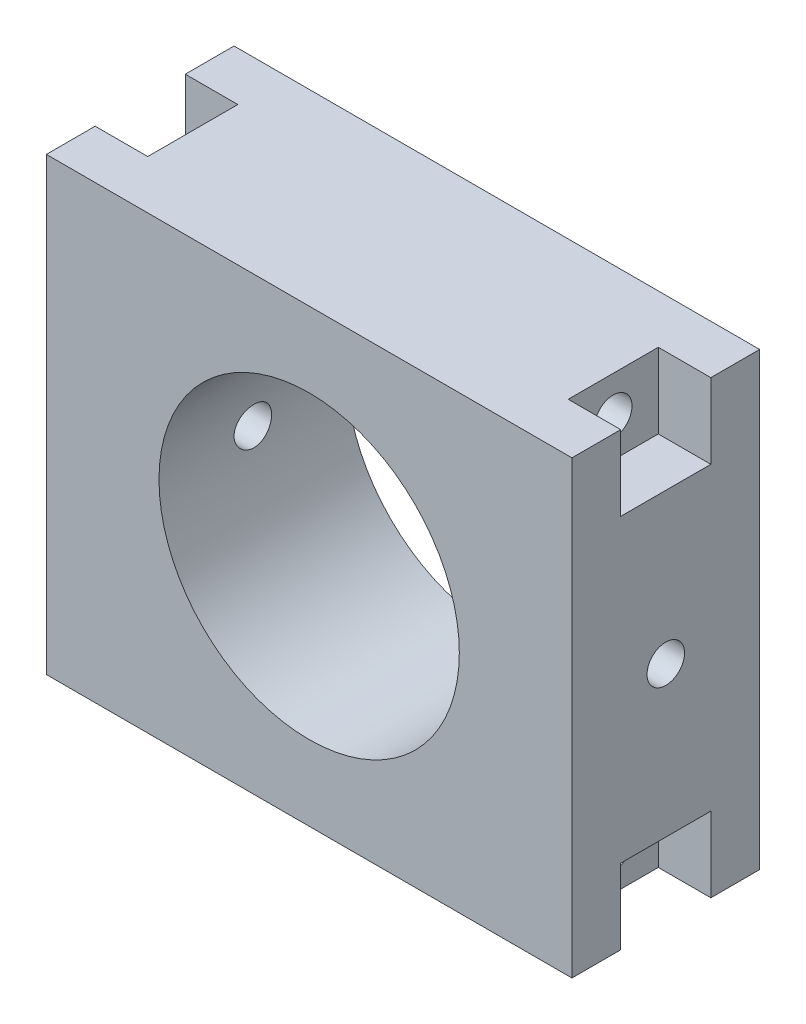
ISO-10303-21;
HEADER;
FILE_DESCRIPTION(('STEP AP214'),'2;1');
FILE_NAME('part.step','',(''),(''),'','','');
FILE_SCHEMA(('AUTOMOTIVE_DESIGN { 1 0 10303 214 1 1 1 1 }'));
ENDSEC;
DATA;
#1=APPLICATION_CONTEXT('core data for automotive mechanical design processes');
#2=APPLICATION_PROTOCOL_DEFINITION('international standard','automotive_design',2000,#1);
#3=PRODUCT_CONTEXT('',#1,'mechanical');
#4=PRODUCT('Part','Part','',(#3));
#5=PRODUCT_RELATED_PRODUCT_CATEGORY('part','',(#4));
#6=PRODUCT_DEFINITION_FORMATION('','',#4);
#7=PRODUCT_DEFINITION_CONTEXT('part definition',#1,'design');
#8=PRODUCT_DEFINITION('design','',#6,#7);
#9=PRODUCT_DEFINITION_SHAPE('','',#8);
#10=(LENGTH_UNIT() NAMED_UNIT(*) SI_UNIT(.MILLI.,.METRE.));
#11=(NAMED_UNIT(*) PLANE_ANGLE_UNIT() SI_UNIT($,.RADIAN.));
#12=(NAMED_UNIT(*) SI_UNIT($,.STERADIAN.) SOLID_ANGLE_UNIT());
#13=UNCERTAINTY_MEASURE_WITH_UNIT(LENGTH_MEASURE(1.E-05),#10,'distance_accuracy_value','');
#14=(GEOMETRIC_REPRESENTATION_CONTEXT(3) GLOBAL_UNCERTAINTY_ASSIGNED_CONTEXT((#13)) GLOBAL_UNIT_ASSIGNED_CONTEXT((#10,
#11,#12)) REPRESENTATION_CONTEXT('',''));
#15=CARTESIAN_POINT('',(0.,0.,0.));
#16=DIRECTION('',(0.,0.,1.));
#17=DIRECTION('',(1.,0.,0.));
#18=AXIS2_PLACEMENT_3D('',#15,#16,#17);
#19=CARTESIAN_POINT('',(35.,0.,25.));
#20=DIRECTION('',(-1.,0.,0.));
#21=DIRECTION('',(0.,0.,1.));
#22=AXIS2_PLACEMENT_3D('',#19,#20,#21);
#23=PLANE('',#22);
#24=CARTESIAN_POINT('',(35.,0.,12.5));
#25=DIRECTION('',(1.,0.,0.));
#26=DIRECTION('',(0.,0.,-1.));
#27=AXIS2_PLACEMENT_3D('',#24,#25,#26);
#28=CIRCLE('',#27,2.5);
#29=CARTESIAN_POINT('',(35.,0.,10.));
#30=VERTEX_POINT('',#29);
#31=EDGE_CURVE('E351',#30,#30,#28,.T.);
#32=ORIENTED_EDGE('',*,*,#31,.F.);
#33=EDGE_LOOP('',(#32));
#34=FACE_BOUND('',#33,.T.);
#35=DIRECTION('',(0.,-1.,0.));
#36=VECTOR('',#35,1.);
#37=CARTESIAN_POINT('',(35.,-20.,6.5));
#38=LINE('',#37,#36);
#39=CARTESIAN_POINT('',(35.,-20.,6.5));
#40=VERTEX_POINT('',#39);
#41=CARTESIAN_POINT('',(35.,-30.,6.5));
#42=VERTEX_POINT('',#41);
#43=EDGE_CURVE('E250',#40,#42,#38,.T.);
#44=ORIENTED_EDGE('',*,*,#43,.T.);
#45=DIRECTION('',(0.,0.,-1.));
#46=VECTOR('',#45,1.);
#47=CARTESIAN_POINT('',(35.,-30.,25.));
#48=LINE('',#47,#46);
#49=CARTESIAN_POINT('',(35.,-30.,0.));
#50=VERTEX_POINT('',#49);
#51=EDGE_CURVE('E380',#42,#50,#48,.T.);
#52=ORIENTED_EDGE('',*,*,#51,.T.);
#53=DIRECTION('',(0.,1.,0.));
#54=VECTOR('',#53,1.);
#55=CARTESIAN_POINT('',(35.,0.,0.));
#56=LINE('',#55,#54);
#57=CARTESIAN_POINT('',(35.,30.,0.));
#58=VERTEX_POINT('',#57);
#59=EDGE_CURVE('E381',#50,#58,#56,.T.);
#60=ORIENTED_EDGE('',*,*,#59,.T.);
#61=DIRECTION('',(0.,0.,-1.));
#62=VECTOR('',#61,1.);
#63=CARTESIAN_POINT('',(35.,30.,25.));
#64=LINE('',#63,#62);
#65=CARTESIAN_POINT('',(35.,30.,6.5));
#66=VERTEX_POINT('',#65);
#67=EDGE_CURVE('E55',#66,#58,#64,.T.);
#68=ORIENTED_EDGE('',*,*,#67,.F.);
#69=DIRECTION('',(0.,1.,0.));
#70=VECTOR('',#69,1.);
#71=CARTESIAN_POINT('',(35.,20.,6.5));
#72=LINE('',#71,#70);
#73=CARTESIAN_POINT('',(35.,20.,6.5));
#74=VERTEX_POINT('',#73);
#75=EDGE_CURVE('E324',#74,#66,#72,.T.);
#76=ORIENTED_EDGE('',*,*,#75,.F.);
#77=DIRECTION('',(0.,0.,1.));
#78=VECTOR('',#77,1.);
#79=CARTESIAN_POINT('',(35.,20.,6.5));
#80=LINE('',#79,#78);
#81=CARTESIAN_POINT('',(35.,20.,18.5));
#82=VERTEX_POINT('',#81);
#83=EDGE_CURVE('E316',#74,#82,#80,.T.);
#84=ORIENTED_EDGE('',*,*,#83,.T.);
#85=DIRECTION('',(0.,1.,0.));
#86=VECTOR('',#85,1.);
#87=CARTESIAN_POINT('',(35.,20.,18.5));
#88=LINE('',#87,#86);
#89=CARTESIAN_POINT('',(35.,30.,18.5));
#90=VERTEX_POINT('',#89);
#91=EDGE_CURVE('E320',#82,#90,#88,.T.);
#92=ORIENTED_EDGE('',*,*,#91,.T.);
#93=CARTESIAN_POINT('',(35.,30.,25.));
#94=VERTEX_POINT('',#93);
#95=EDGE_CURVE('E11',#94,#90,#64,.T.);
#96=ORIENTED_EDGE('',*,*,#95,.F.);
#97=DIRECTION('',(0.,1.,0.));
#98=VECTOR('',#97,1.);
#99=CARTESIAN_POINT('',(35.,0.,25.));
#100=LINE('',#99,#98);
#101=CARTESIAN_POINT('',(35.,-30.,25.));
#102=VERTEX_POINT('',#101);
#103=EDGE_CURVE('E361',#102,#94,#100,.T.);
#104=ORIENTED_EDGE('',*,*,#103,.F.);
#105=CARTESIAN_POINT('',(35.,-30.,18.5));
#106=VERTEX_POINT('',#105);
#107=EDGE_CURVE('E401',#102,#106,#48,.T.);
#108=ORIENTED_EDGE('',*,*,#107,.T.);
#109=DIRECTION('',(0.,-1.,0.));
#110=VECTOR('',#109,1.);
#111=CARTESIAN_POINT('',(35.,-20.,18.5));
#112=LINE('',#111,#110);
#113=CARTESIAN_POINT('',(35.,-20.,18.5));
#114=VERTEX_POINT('',#113);
#115=EDGE_CURVE('E71',#114,#106,#112,.T.);
#116=ORIENTED_EDGE('',*,*,#115,.F.);
#117=DIRECTION('',(0.,0.,1.));
#118=VECTOR('',#117,1.);
#119=CARTESIAN_POINT('',(35.,-20.,6.5));
#120=LINE('',#119,#118);
#121=EDGE_CURVE('E238',#40,#114,#120,.T.);
#122=ORIENTED_EDGE('',*,*,#121,.F.);
#123=EDGE_LOOP('',(#44,#52,#60,#68,#76,#84,#92,#96,#104,#108,#116,#122));
#124=FACE_BOUND('',#123,.T.);
#125=ADVANCED_FACE('F46',(#34,#124),#23,.F.);
#126=CARTESIAN_POINT('',(0.,-30.,25.));
#127=DIRECTION('',(0.,1.,0.));
#128=DIRECTION('',(0.,0.,1.));
#129=AXIS2_PLACEMENT_3D('',#126,#127,#128);
#130=PLANE('',#129);
#131=DIRECTION('',(0.,0.,1.));
#132=VECTOR('',#131,1.);
#133=CARTESIAN_POINT('',(-28.,-30.,0.));
#134=LINE('',#133,#132);
#135=CARTESIAN_POINT('',(-28.,-30.,6.5));
#136=VERTEX_POINT('',#135);
#137=CARTESIAN_POINT('',(-28.,-30.,18.5));
#138=VERTEX_POINT('',#137);
#139=EDGE_CURVE('E63',#136,#138,#134,.T.);
#140=ORIENTED_EDGE('',*,*,#139,.F.);
#141=DIRECTION('',(1.,0.,0.));
#142=VECTOR('',#141,1.);
#143=CARTESIAN_POINT('',(0.,-30.,6.5));
#144=LINE('',#143,#142);
#145=CARTESIAN_POINT('',(-35.,-30.,6.5));
#146=VERTEX_POINT('',#145);
#147=EDGE_CURVE('E209',#146,#136,#144,.T.);
#148=ORIENTED_EDGE('',*,*,#147,.F.);
#149=DIRECTION('',(0.,0.,-1.));
#150=VECTOR('',#149,1.);
#151=CARTESIAN_POINT('',(-35.,-30.,25.));
#152=LINE('',#151,#150);
#153=CARTESIAN_POINT('',(-35.,-30.,0.));
#154=VERTEX_POINT('',#153);
#155=EDGE_CURVE('E405',#146,#154,#152,.T.);
#156=ORIENTED_EDGE('',*,*,#155,.T.);
#157=DIRECTION('',(1.,0.,0.));
#158=VECTOR('',#157,1.);
#159=CARTESIAN_POINT('',(0.,-30.,0.));
#160=LINE('',#159,#158);
#161=EDGE_CURVE('E394',#154,#50,#160,.T.);
#162=ORIENTED_EDGE('',*,*,#161,.T.);
#163=ORIENTED_EDGE('',*,*,#51,.F.);
#164=DIRECTION('',(-1.,0.,0.));
#165=VECTOR('',#164,1.);
#166=CARTESIAN_POINT('',(35.,-30.,6.5));
#167=LINE('',#166,#165);
#168=CARTESIAN_POINT('',(28.,-30.,6.5));
#169=VERTEX_POINT('',#168);
#170=EDGE_CURVE('E251',#42,#169,#167,.T.);
#171=ORIENTED_EDGE('',*,*,#170,.T.);
#172=DIRECTION('',(0.,0.,1.));
#173=VECTOR('',#172,1.);
#174=CARTESIAN_POINT('',(28.,-30.,6.5));
#175=LINE('',#174,#173);
#176=CARTESIAN_POINT('',(28.,-30.,18.5));
#177=VERTEX_POINT('',#176);
#178=EDGE_CURVE('E239',#169,#177,#175,.T.);
#179=ORIENTED_EDGE('',*,*,#178,.T.);
#180=DIRECTION('',(-1.,0.,0.));
#181=VECTOR('',#180,1.);
#182=CARTESIAN_POINT('',(35.,-30.,18.5));
#183=LINE('',#182,#181);
#184=EDGE_CURVE('E255',#106,#177,#183,.T.);
#185=ORIENTED_EDGE('',*,*,#184,.F.);
#186=ORIENTED_EDGE('',*,*,#107,.F.);
#187=DIRECTION('',(1.,0.,0.));
#188=VECTOR('',#187,1.);
#189=CARTESIAN_POINT('',(0.,-30.,25.));
#190=LINE('',#189,#188);
#191=CARTESIAN_POINT('',(-35.,-30.,25.));
#192=VERTEX_POINT('',#191);
#193=EDGE_CURVE('E373',#192,#102,#190,.T.);
#194=ORIENTED_EDGE('',*,*,#193,.F.);
#195=CARTESIAN_POINT('',(-35.,-30.,18.5));
#196=VERTEX_POINT('',#195);
#197=EDGE_CURVE('E406',#192,#196,#152,.T.);
#198=ORIENTED_EDGE('',*,*,#197,.T.);
#199=DIRECTION('',(1.,0.,0.));
#200=VECTOR('',#199,1.);
#201=CARTESIAN_POINT('',(0.,-30.,18.5));
#202=LINE('',#201,#200);
#203=EDGE_CURVE('E213',#196,#138,#202,.T.);
#204=ORIENTED_EDGE('',*,*,#203,.T.);
#205=EDGE_LOOP('',(#140,#148,#156,#162,#163,#171,#179,#185,#186,#194,#198,#204));
#206=FACE_BOUND('',#205,.T.);
#207=ADVANCED_FACE('F453',(#206),#130,.F.);
#208=CARTESIAN_POINT('',(0.,30.,25.));
#209=DIRECTION('',(0.,1.,0.));
#210=DIRECTION('',(0.,0.,1.));
#211=AXIS2_PLACEMENT_3D('',#208,#209,#210);
#212=PLANE('',#211);
#213=DIRECTION('',(1.,0.,0.));
#214=VECTOR('',#213,1.);
#215=CARTESIAN_POINT('',(0.,30.,18.5));
#216=LINE('',#215,#214);
#217=CARTESIAN_POINT('',(-35.,30.,18.5));
#218=VERTEX_POINT('',#217);
#219=CARTESIAN_POINT('',(-28.,30.,18.5));
#220=VERTEX_POINT('',#219);
#221=EDGE_CURVE('E276',#218,#220,#216,.T.);
#222=ORIENTED_EDGE('',*,*,#221,.F.);
#223=DIRECTION('',(0.,0.,-1.));
#224=VECTOR('',#223,1.);
#225=CARTESIAN_POINT('',(-35.,30.,25.));
#226=LINE('',#225,#224);
#227=CARTESIAN_POINT('',(-35.,30.,25.));
#228=VERTEX_POINT('',#227);
#229=EDGE_CURVE('E411',#228,#218,#226,.T.);
#230=ORIENTED_EDGE('',*,*,#229,.F.);
#231=DIRECTION('',(1.,0.,0.));
#232=VECTOR('',#231,1.);
#233=CARTESIAN_POINT('',(0.,30.,25.));
#234=LINE('',#233,#232);
#235=EDGE_CURVE('E364',#228,#94,#234,.T.);
#236=ORIENTED_EDGE('',*,*,#235,.T.);
#237=ORIENTED_EDGE('',*,*,#95,.T.);
#238=DIRECTION('',(-1.,0.,0.));
#239=VECTOR('',#238,1.);
#240=CARTESIAN_POINT('',(35.,30.,18.5));
#241=LINE('',#240,#239);
#242=CARTESIAN_POINT('',(28.,30.,18.5));
#243=VERTEX_POINT('',#242);
#244=EDGE_CURVE('E327',#90,#243,#241,.T.);
#245=ORIENTED_EDGE('',*,*,#244,.T.);
#246=DIRECTION('',(0.,0.,1.));
#247=VECTOR('',#246,1.);
#248=CARTESIAN_POINT('',(28.,30.,6.5));
#249=LINE('',#248,#247);
#250=CARTESIAN_POINT('',(28.,30.,6.5));
#251=VERTEX_POINT('',#250);
#252=EDGE_CURVE('E331',#251,#243,#249,.T.);
#253=ORIENTED_EDGE('',*,*,#252,.F.);
#254=DIRECTION('',(-1.,0.,0.));
#255=VECTOR('',#254,1.);
#256=CARTESIAN_POINT('',(35.,30.,6.5));
#257=LINE('',#256,#255);
#258=EDGE_CURVE('E292',#66,#251,#257,.T.);
#259=ORIENTED_EDGE('',*,*,#258,.F.);
#260=ORIENTED_EDGE('',*,*,#67,.T.);
#261=DIRECTION('',(1.,0.,0.));
#262=VECTOR('',#261,1.);
#263=CARTESIAN_POINT('',(0.,30.,0.));
#264=LINE('',#263,#262);
#265=CARTESIAN_POINT('',(-35.,30.,0.));
#266=VERTEX_POINT('',#265);
#267=EDGE_CURVE('E385',#266,#58,#264,.T.);
#268=ORIENTED_EDGE('',*,*,#267,.F.);
#269=CARTESIAN_POINT('',(-35.,30.,6.5));
#270=VERTEX_POINT('',#269);
#271=EDGE_CURVE('E410',#270,#266,#226,.T.);
#272=ORIENTED_EDGE('',*,*,#271,.F.);
#273=DIRECTION('',(1.,0.,0.));
#274=VECTOR('',#273,1.);
#275=CARTESIAN_POINT('',(0.,30.,6.5));
#276=LINE('',#275,#274);
#277=CARTESIAN_POINT('',(-28.,30.,6.5));
#278=VERTEX_POINT('',#277);
#279=EDGE_CURVE('E291',#270,#278,#276,.T.);
#280=ORIENTED_EDGE('',*,*,#279,.T.);
#281=DIRECTION('',(0.,0.,1.));
#282=VECTOR('',#281,1.);
#283=CARTESIAN_POINT('',(-28.,30.,0.));
#284=LINE('',#283,#282);
#285=EDGE_CURVE('E287',#278,#220,#284,.T.);
#286=ORIENTED_EDGE('',*,*,#285,.T.);
#287=EDGE_LOOP('',(#222,#230,#236,#237,#245,#253,#259,#260,#268,#272,#280,#286));
#288=FACE_BOUND('',#287,.T.);
#289=ADVANCED_FACE('F459',(#288),#212,.T.);
#290=CARTESIAN_POINT('',(-35.,0.,25.));
#291=DIRECTION('',(-1.,0.,0.));
#292=DIRECTION('',(0.,0.,1.));
#293=AXIS2_PLACEMENT_3D('',#290,#291,#292);
#294=PLANE('',#293);
#295=DIRECTION('',(0.,-1.,0.));
#296=VECTOR('',#295,1.);
#297=CARTESIAN_POINT('',(-35.,-20.,6.5));
#298=LINE('',#297,#296);
#299=CARTESIAN_POINT('',(-35.,-20.,6.5));
#300=VERTEX_POINT('',#299);
#301=EDGE_CURVE('E229',#300,#146,#298,.T.);
#302=ORIENTED_EDGE('',*,*,#301,.F.);
#303=DIRECTION('',(0.,0.,1.));
#304=VECTOR('',#303,1.);
#305=CARTESIAN_POINT('',(-35.,-20.,0.));
#306=LINE('',#305,#304);
#307=CARTESIAN_POINT('',(-35.,-20.,18.5));
#308=VERTEX_POINT('',#307);
#309=EDGE_CURVE('E196',#300,#308,#306,.T.);
#310=ORIENTED_EDGE('',*,*,#309,.T.);
#311=DIRECTION('',(0.,-1.,0.));
#312=VECTOR('',#311,1.);
#313=CARTESIAN_POINT('',(-35.,-20.,18.5));
#314=LINE('',#313,#312);
#315=EDGE_CURVE('E191',#308,#196,#314,.T.);
#316=ORIENTED_EDGE('',*,*,#315,.T.);
#317=ORIENTED_EDGE('',*,*,#197,.F.);
#318=DIRECTION('',(0.,1.,0.));
#319=VECTOR('',#318,1.);
#320=CARTESIAN_POINT('',(-35.,0.,25.));
#321=LINE('',#320,#319);
#322=EDGE_CURVE('E369',#192,#228,#321,.T.);
#323=ORIENTED_EDGE('',*,*,#322,.T.);
#324=ORIENTED_EDGE('',*,*,#229,.T.);
#325=DIRECTION('',(0.,1.,0.));
#326=VECTOR('',#325,1.);
#327=CARTESIAN_POINT('',(-35.,20.,18.5));
#328=LINE('',#327,#326);
#329=CARTESIAN_POINT('',(-35.,20.,18.5));
#330=VERTEX_POINT('',#329);
#331=EDGE_CURVE('E303',#330,#218,#328,.T.);
#332=ORIENTED_EDGE('',*,*,#331,.F.);
#333=DIRECTION('',(0.,0.,1.));
#334=VECTOR('',#333,1.);
#335=CARTESIAN_POINT('',(-35.,20.,0.));
#336=LINE('',#335,#334);
#337=CARTESIAN_POINT('',(-35.,20.,6.5));
#338=VERTEX_POINT('',#337);
#339=EDGE_CURVE('E279',#338,#330,#336,.T.);
#340=ORIENTED_EDGE('',*,*,#339,.F.);
#341=DIRECTION('',(0.,1.,0.));
#342=VECTOR('',#341,1.);
#343=CARTESIAN_POINT('',(-35.,20.,6.5));
#344=LINE('',#343,#342);
#345=EDGE_CURVE('E306',#338,#270,#344,.T.);
#346=ORIENTED_EDGE('',*,*,#345,.T.);
#347=ORIENTED_EDGE('',*,*,#271,.T.);
#348=DIRECTION('',(0.,1.,0.));
#349=VECTOR('',#348,1.);
#350=CARTESIAN_POINT('',(-35.,0.,0.));
#351=LINE('',#350,#349);
#352=EDGE_CURVE('E390',#154,#266,#351,.T.);
#353=ORIENTED_EDGE('',*,*,#352,.F.);
#354=ORIENTED_EDGE('',*,*,#155,.F.);
#355=EDGE_LOOP('',(#302,#310,#316,#317,#323,#324,#332,#340,#346,#347,#353,#354));
#356=FACE_BOUND('',#355,.T.);
#357=CARTESIAN_POINT('',(-35.,0.,12.5));
#358=DIRECTION('',(1.,0.,0.));
#359=DIRECTION('',(0.,0.,-1.));
#360=AXIS2_PLACEMENT_3D('',#357,#358,#359);
#361=CIRCLE('',#360,2.5);
#362=CARTESIAN_POINT('',(-35.,0.,10.));
#363=VERTEX_POINT('',#362);
#364=EDGE_CURVE('E356',#363,#363,#361,.T.);
#365=ORIENTED_EDGE('',*,*,#364,.T.);
#366=EDGE_LOOP('',(#365));
#367=FACE_BOUND('',#366,.T.);
#368=ADVANCED_FACE('F603',(#356,#367),#294,.T.);
#369=CARTESIAN_POINT('',(0.,0.,25.));
#370=DIRECTION('',(0.,0.,-1.));
#371=DIRECTION('',(-1.,0.,0.));
#372=AXIS2_PLACEMENT_3D('',#369,#370,#371);
#373=CYLINDRICAL_SURFACE('',#372,20.);
#374=CARTESIAN_POINT('',(-20.,0.,15.));
#375=CARTESIAN_POINT('',(-19.9999980489643,-0.139841095555761,14.9999940590643));
#376=CARTESIAN_POINT('',(-19.998517845549,-0.279769574302747,14.9882271208307));
#377=CARTESIAN_POINT('',(-19.9927554011136,-0.555732802089753,14.9414722454292));
#378=CARTESIAN_POINT('',(-19.9884702344143,-0.691763330623745,14.9064600620766));
#379=CARTESIAN_POINT('',(-19.9775806104441,-0.955895574813054,14.8142623560859));
#380=CARTESIAN_POINT('',(-19.9709777145554,-1.08400256014614,14.7570917581901));
#381=CARTESIAN_POINT('',(-19.956187008781,-1.32877947489304,14.6222327160302));
#382=CARTESIAN_POINT('',(-19.9479994708412,-1.44545136155637,14.5445477914693));
#383=CARTESIAN_POINT('',(-19.9309032130632,-1.66471281693132,14.3704080501604));
#384=CARTESIAN_POINT('',(-19.9219911469242,-1.76723036493713,14.2738628706538));
#385=CARTESIAN_POINT('',(-19.9044772600975,-1.95465279355749,14.0649371764634));
#386=CARTESIAN_POINT('',(-19.8958754552427,-2.03955677639225,13.9525558550868));
#387=CARTESIAN_POINT('',(-19.8799230561958,-2.18961016128394,13.7146800224343));
#388=CARTESIAN_POINT('',(-19.8725767717791,-2.25469209594107,13.5891426384321));
#389=CARTESIAN_POINT('',(-19.8600112845768,-2.36282307657512,13.3288129480526));
#390=CARTESIAN_POINT('',(-19.8547920011313,-2.40587295806522,13.194020992853));
#391=CARTESIAN_POINT('',(-19.8471033960361,-2.46849898002476,12.9197558044132));
#392=CARTESIAN_POINT('',(-19.8446198343674,-2.4881967147317,12.7803107422958));
#393=CARTESIAN_POINT('',(-19.8426402814279,-2.50393554955723,12.5000737365282));
#394=CARTESIAN_POINT('',(-19.8431441700151,-2.49997760100242,12.3592818472687));
#395=CARTESIAN_POINT('',(-19.8470695536975,-2.4686172364479,12.0811951727512));
#396=CARTESIAN_POINT('',(-19.8504743796033,-2.4413487629847,11.9438850137997));
#397=CARTESIAN_POINT('',(-19.8597919975763,-2.36435038318205,11.675804978781));
#398=CARTESIAN_POINT('',(-19.8657048404572,-2.3146200217519,11.545035235286));
#399=CARTESIAN_POINT('',(-19.8793911586465,-2.19396555991165,11.2933320009783));
#400=CARTESIAN_POINT('',(-19.8871697321144,-2.12298325370764,11.172426699751));
#401=CARTESIAN_POINT('',(-19.903707114306,-1.96188146945692,10.9441933055868));
#402=CARTESIAN_POINT('',(-19.9124659678566,-1.87176111608078,10.8368658340263));
#403=CARTESIAN_POINT('',(-19.9300510989042,-1.67419911075378,10.6380572892773));
#404=CARTESIAN_POINT('',(-19.9388774238689,-1.56664200784001,10.546690908234));
#405=CARTESIAN_POINT('',(-19.9555463255585,-1.33765716911392,10.3832911199695));
#406=CARTESIAN_POINT('',(-19.963388900015,-1.21622940131825,10.311257757328));
#407=CARTESIAN_POINT('',(-19.9772115221858,-0.962861671363481,10.1885686795361));
#408=CARTESIAN_POINT('',(-19.9831909440154,-0.830918195337716,10.1379201461188));
#409=CARTESIAN_POINT('',(-19.9926078578006,-0.560307940431055,10.0595295064767));
#410=CARTESIAN_POINT('',(-19.9960454687587,-0.421641476630666,10.031786327863));
#411=CARTESIAN_POINT('',(-19.9999759641076,-0.142513163913497,10.0001425757394));
#412=CARTESIAN_POINT('',(-20.0004883614263,-0.00206949019860642,9.99608400763593));
#413=CARTESIAN_POINT('',(-19.9985633800543,0.277496036497497,10.011507734056));
#414=CARTESIAN_POINT('',(-19.9961260641821,0.416617917564707,10.0309895272516));
#415=CARTESIAN_POINT('',(-19.9885876875669,0.689124507721523,10.0928097087744));
#416=CARTESIAN_POINT('',(-19.9834954081387,0.822526570424706,10.1350727634026));
#417=CARTESIAN_POINT('',(-19.971217231002,1.08034965485841,10.2411774519129));
#418=CARTESIAN_POINT('',(-19.9640312622062,1.20477037146531,10.3050198184914));
#419=CARTESIAN_POINT('',(-19.9483182291011,1.44180452068743,10.4528531375075));
#420=CARTESIAN_POINT('',(-19.9397844404251,1.55435375994382,10.5369462898056));
#421=CARTESIAN_POINT('',(-19.9223514232566,1.76379698962632,10.7227494975342));
#422=CARTESIAN_POINT('',(-19.913452180269,1.86069035833686,10.824460252251));
#423=CARTESIAN_POINT('',(-19.8962310546258,2.03663195881802,11.0433074167571));
#424=CARTESIAN_POINT('',(-19.8879127472133,2.11557546056793,11.1605283463104));
#425=CARTESIAN_POINT('',(-19.8728541103715,2.25265288944351,11.4066582448547));
#426=CARTESIAN_POINT('',(-19.8661137493103,2.31078723372837,11.5355669794765));
#427=CARTESIAN_POINT('',(-19.8549985039299,2.40442657886654,11.8010753191476));
#428=CARTESIAN_POINT('',(-19.8506174518479,2.43999062745711,11.937653830048));
#429=CARTESIAN_POINT('',(-19.8446991590745,2.48766999386785,12.2149024837807));
#430=CARTESIAN_POINT('',(-19.8431617860878,2.49978640253576,12.355572435959));
#431=CARTESIAN_POINT('',(-19.8431087698245,2.50020653608484,12.6359689292047));
#432=CARTESIAN_POINT('',(-19.8445722475195,2.48867479769927,12.7756952483319));
#433=CARTESIAN_POINT('',(-19.850311145372,2.44247440484933,13.0512071293451));
#434=CARTESIAN_POINT('',(-19.8545865658308,2.40780574790577,13.1869926908088));
#435=CARTESIAN_POINT('',(-19.8654611577455,2.31636707368966,13.4507469567664));
#436=CARTESIAN_POINT('',(-19.8720594959278,2.25960498097093,13.5787184450218));
#437=CARTESIAN_POINT('',(-19.8868378324482,2.12560690215031,13.8233466540483));
#438=CARTESIAN_POINT('',(-19.8950178506041,2.04837065950959,13.9400032330198));
#439=CARTESIAN_POINT('',(-19.9121060475223,1.87500633126584,14.1595312253405));
#440=CARTESIAN_POINT('',(-19.9210187208403,1.77875562577496,14.262305460955));
#441=CARTESIAN_POINT('',(-19.938528315929,1.57035022696838,14.450306825168));
#442=CARTESIAN_POINT('',(-19.9471251627559,1.45819178914157,14.5355298107743));
#443=CARTESIAN_POINT('',(-19.9630705658675,1.22066562085421,14.6862853571053));
#444=CARTESIAN_POINT('',(-19.970414250783,1.09524927959617,14.7517418058993));
#445=CARTESIAN_POINT('',(-19.9829764907672,0.835182902301281,14.8605712429163));
#446=CARTESIAN_POINT('',(-19.9881973536957,0.700543080870236,14.9039682263535));
#447=CARTESIAN_POINT('',(-19.9946672032774,0.471005771967925,14.9570593381713));
#448=CARTESIAN_POINT('',(-19.9966572589545,0.377555663516921,14.9731389419821));
#449=CARTESIAN_POINT('',(-19.9993243132919,0.189417063212436,14.9946112456932));
#450=CARTESIAN_POINT('',(-20.0000013216347,0.0947285804960276,15.0000040243993));
#451=CARTESIAN_POINT('',(-20.,0.,15.));
#452=B_SPLINE_CURVE_WITH_KNOTS('',3,(#374,#375,#376,#377,#378,#379,#380,#381,#382,#383,#384,
#385,#386,#387,#388,#389,#390,#391,#392,#393,#394,#395,#396,#397,#398,#399,#400,#401,#402,#403,
#404,#405,#406,#407,#408,#409,#410,#411,#412,#413,#414,#415,#416,#417,#418,#419,#420,#421,#422,
#423,#424,#425,#426,#427,#428,#429,#430,#431,#432,#433,#434,#435,#436,#437,#438,#439,#440,#441,
#442,#443,#444,#445,#446,#447,#448,#449,#450,#451),.UNSPECIFIED.,.T.,.F.,(4,2,2,2,2,2,2,2,2,2,2,
2,2,2,2,2,2,2,2,2,2,2,2,2,2,2,2,2,2,2,2,2,2,2,2,2,2,2,4),(0.,0.419177272776247,
0.838792460943427,1.25812550818177,1.67738665591073,2.09870813201843,2.52005107800011,
2.94281250318869,3.36555789496807,3.78609225286321,4.20660969884664,4.62472696441692,
5.04285270166241,5.46213426285534,5.88143500513639,6.30363478136417,6.72583553113114,
7.14817795731605,7.57050060903781,7.99000279391921,8.40949604501929,8.82761053893396,
9.24573923078948,9.66602402928422,10.0863255137509,10.5090197150757,10.9317054422154,
11.3532807428093,11.7748364301062,12.1934690120222,12.6121016387955,13.0305842470649,
13.4490720991226,13.8703523769183,14.2917319847001,14.7147140303685,15.1372349868403,
15.4211884318763,15.7051397830044),.UNSPECIFIED.);
#453=CARTESIAN_POINT('',(-20.,0.,15.));
#454=VERTEX_POINT('',#453);
#455=EDGE_CURVE('E386',#454,#454,#452,.T.);
#456=ORIENTED_EDGE('',*,*,#455,.F.);
#457=EDGE_LOOP('',(#456));
#458=FACE_BOUND('',#457,.T.);
#459=CARTESIAN_POINT('',(20.,0.,10.));
#460=CARTESIAN_POINT('',(19.9999980489643,-0.139841095555761,10.0000059409357));
#461=CARTESIAN_POINT('',(19.998517845549,-0.279769574302747,10.0117728791693));
#462=CARTESIAN_POINT('',(19.9927554011136,-0.555732802089753,10.0585277545708));
#463=CARTESIAN_POINT('',(19.9884702344143,-0.691763330623745,10.0935399379234));
#464=CARTESIAN_POINT('',(19.9775806104441,-0.955895574813054,10.1857376439141));
#465=CARTESIAN_POINT('',(19.9709777145554,-1.08400256014614,10.2429082418099));
#466=CARTESIAN_POINT('',(19.956187008781,-1.32877947489304,10.3777672839698));
#467=CARTESIAN_POINT('',(19.9479994708412,-1.44545136155637,10.4554522085307));
#468=CARTESIAN_POINT('',(19.9309032130632,-1.66471281693132,10.6295919498396));
#469=CARTESIAN_POINT('',(19.9219911469242,-1.76723036493713,10.7261371293462));
#470=CARTESIAN_POINT('',(19.9044772600975,-1.95465279355749,10.9350628235366));
#471=CARTESIAN_POINT('',(19.8958754552427,-2.03955677639225,11.0474441449132));
#472=CARTESIAN_POINT('',(19.8799230561958,-2.18961016128394,11.2853199775657));
#473=CARTESIAN_POINT('',(19.8725767717791,-2.25469209594107,11.4108573615679));
#474=CARTESIAN_POINT('',(19.8600112845768,-2.36282307657512,11.6711870519474));
#475=CARTESIAN_POINT('',(19.8547920011313,-2.40587295806522,11.805979007147));
#476=CARTESIAN_POINT('',(19.8471033960361,-2.46849898002476,12.0802441955868));
#477=CARTESIAN_POINT('',(19.8446198343674,-2.4881967147317,12.2196892577042));
#478=CARTESIAN_POINT('',(19.8426402814279,-2.50393554955723,12.4999262634718));
#479=CARTESIAN_POINT('',(19.8431441700151,-2.49997760100242,12.6407181527313));
#480=CARTESIAN_POINT('',(19.8470695536975,-2.4686172364479,12.9188048272488));
#481=CARTESIAN_POINT('',(19.8504743796033,-2.4413487629847,13.0561149862003));
#482=CARTESIAN_POINT('',(19.8597919975763,-2.36435038318205,13.324195021219));
#483=CARTESIAN_POINT('',(19.8657048404572,-2.3146200217519,13.454964764714));
#484=CARTESIAN_POINT('',(19.8793911586465,-2.19396555991165,13.7066679990217));
#485=CARTESIAN_POINT('',(19.8871697321144,-2.12298325370764,13.827573300249));
#486=CARTESIAN_POINT('',(19.903707114306,-1.96188146945692,14.0558066944132));
#487=CARTESIAN_POINT('',(19.9124659678566,-1.87176111608078,14.1631341659737));
#488=CARTESIAN_POINT('',(19.9300510989042,-1.67419911075378,14.3619427107227));
#489=CARTESIAN_POINT('',(19.9388774238689,-1.56664200784001,14.453309091766));
#490=CARTESIAN_POINT('',(19.9555463255585,-1.33765716911392,14.6167088800305));
#491=CARTESIAN_POINT('',(19.963388900015,-1.21622940131825,14.688742242672));
#492=CARTESIAN_POINT('',(19.9772115221858,-0.962861671363481,14.8114313204639));
#493=CARTESIAN_POINT('',(19.9831909440154,-0.830918195337716,14.8620798538812));
#494=CARTESIAN_POINT('',(19.9926078578006,-0.560307940431055,14.9404704935233));
#495=CARTESIAN_POINT('',(19.9960454687587,-0.421641476630666,14.9682136721371));
#496=CARTESIAN_POINT('',(19.9999759641076,-0.142513163913497,14.9998574242606));
#497=CARTESIAN_POINT('',(20.0004883614263,-0.00206949019860645,15.0039159923641));
#498=CARTESIAN_POINT('',(19.9985633800543,0.277496036497497,14.988492265944));
#499=CARTESIAN_POINT('',(19.9961260641821,0.416617917564707,14.9690104727484));
#500=CARTESIAN_POINT('',(19.9885876875669,0.689124507721522,14.9071902912256));
#501=CARTESIAN_POINT('',(19.9834954081387,0.822526570424705,14.8649272365974));
#502=CARTESIAN_POINT('',(19.971217231002,1.08034965485841,14.7588225480871));
#503=CARTESIAN_POINT('',(19.9640312622062,1.20477037146531,14.6949801815086));
#504=CARTESIAN_POINT('',(19.9483182291011,1.44180452068743,14.5471468624925));
#505=CARTESIAN_POINT('',(19.9397844404251,1.55435375994382,14.4630537101944));
#506=CARTESIAN_POINT('',(19.9223514232566,1.76379698962632,14.2772505024658));
#507=CARTESIAN_POINT('',(19.913452180269,1.86069035833686,14.175539747749));
#508=CARTESIAN_POINT('',(19.8962310546258,2.03663195881802,13.9566925832429));
#509=CARTESIAN_POINT('',(19.8879127472133,2.11557546056793,13.8394716536896));
#510=CARTESIAN_POINT('',(19.8728541103715,2.25265288944351,13.5933417551453));
#511=CARTESIAN_POINT('',(19.8661137493103,2.31078723372837,13.4644330205235));
#512=CARTESIAN_POINT('',(19.8549985039299,2.40442657886654,13.1989246808524));
#513=CARTESIAN_POINT('',(19.8506174518479,2.43999062745711,13.062346169952));
#514=CARTESIAN_POINT('',(19.8446991590745,2.48766999386785,12.7850975162193));
#515=CARTESIAN_POINT('',(19.8431617860878,2.49978640253576,12.644427564041));
#516=CARTESIAN_POINT('',(19.8431087698245,2.50020653608484,12.3640310707953));
#517=CARTESIAN_POINT('',(19.8445722475195,2.48867479769927,12.2243047516681));
#518=CARTESIAN_POINT('',(19.850311145372,2.44247440484933,11.9487928706549));
#519=CARTESIAN_POINT('',(19.8545865658308,2.40780574790577,11.8130073091912));
#520=CARTESIAN_POINT('',(19.8654611577455,2.31636707368966,11.5492530432336));
#521=CARTESIAN_POINT('',(19.8720594959278,2.25960498097093,11.4212815549782));
#522=CARTESIAN_POINT('',(19.8868378324482,2.12560690215031,11.1766533459517));
#523=CARTESIAN_POINT('',(19.8950178506041,2.04837065950959,11.0599967669802));
#524=CARTESIAN_POINT('',(19.9121060475223,1.87500633126584,10.8404687746595));
#525=CARTESIAN_POINT('',(19.9210187208403,1.77875562577496,10.737694539045));
#526=CARTESIAN_POINT('',(19.938528315929,1.57035022696838,10.549693174832));
#527=CARTESIAN_POINT('',(19.9471251627559,1.45819178914157,10.4644701892257));
#528=CARTESIAN_POINT('',(19.9630705658675,1.22066562085421,10.3137146428947));
#529=CARTESIAN_POINT('',(19.970414250783,1.09524927959617,10.2482581941007));
#530=CARTESIAN_POINT('',(19.9829764907672,0.835182902301281,10.1394287570837));
#531=CARTESIAN_POINT('',(19.9881973536957,0.700543080870236,10.0960317736465));
#532=CARTESIAN_POINT('',(19.9946672032774,0.471005771967925,10.0429406618287));
#533=CARTESIAN_POINT('',(19.9966572589545,0.377555663516921,10.0268610580179));
#534=CARTESIAN_POINT('',(19.9993243132919,0.189417063212436,10.0053887543068));
#535=CARTESIAN_POINT('',(20.0000013216347,0.0947285804960276,9.9999959756007));
#536=CARTESIAN_POINT('',(20.,0.,10.));
#537=B_SPLINE_CURVE_WITH_KNOTS('',3,(#459,#460,#461,#462,#463,#464,#465,#466,#467,#468,#469,
#470,#471,#472,#473,#474,#475,#476,#477,#478,#479,#480,#481,#482,#483,#484,#485,#486,#487,#488,
#489,#490,#491,#492,#493,#494,#495,#496,#497,#498,#499,#500,#501,#502,#503,#504,#505,#506,#507,
#508,#509,#510,#511,#512,#513,#514,#515,#516,#517,#518,#519,#520,#521,#522,#523,#524,#525,#526,
#527,#528,#529,#530,#531,#532,#533,#534,#535,#536),.UNSPECIFIED.,.T.,.F.,(4,2,2,2,2,2,2,2,2,2,2,
2,2,2,2,2,2,2,2,2,2,2,2,2,2,2,2,2,2,2,2,2,2,2,2,2,2,2,4),(0.,0.419177272776247,
0.838792460943427,1.25812550818177,1.67738665591073,2.09870813201843,2.52005107800011,
2.94281250318869,3.36555789496807,3.78609225286321,4.20660969884664,4.62472696441692,
5.04285270166241,5.46213426285534,5.88143500513639,6.30363478136417,6.72583553113114,
7.14817795731605,7.5705006090378,7.99000279391921,8.40949604501929,8.82761053893396,
9.24573923078948,9.66602402928423,10.0863255137509,10.5090197150757,10.9317054422154,
11.3532807428092,11.7748364301062,12.1934690120222,12.6121016387955,13.0305842470649,
13.4490720991226,13.8703523769183,14.2917319847001,14.7147140303685,15.1372349868403,
15.4211884318763,15.7051397830044),.UNSPECIFIED.);
#538=CARTESIAN_POINT('',(20.,0.,10.));
#539=VERTEX_POINT('',#538);
#540=EDGE_CURVE('E355',#539,#539,#537,.T.);
#541=ORIENTED_EDGE('',*,*,#540,.F.);
#542=EDGE_LOOP('',(#541));
#543=FACE_BOUND('',#542,.T.);
#544=CARTESIAN_POINT('',(0.,0.,25.));
#545=DIRECTION('',(0.,0.,1.));
#546=DIRECTION('',(1.,0.,0.));
#547=AXIS2_PLACEMENT_3D('',#544,#545,#546);
#548=CIRCLE('',#547,20.);
#549=CARTESIAN_POINT('',(20.,0.,25.));
#550=VERTEX_POINT('',#549);
#551=EDGE_CURVE('E376',#550,#550,#548,.T.);
#552=ORIENTED_EDGE('',*,*,#551,.T.);
#553=EDGE_LOOP('',(#552));
#554=FACE_BOUND('',#553,.T.);
#555=CARTESIAN_POINT('',(0.,0.,0.));
#556=DIRECTION('',(0.,0.,1.));
#557=DIRECTION('',(1.,0.,0.));
#558=AXIS2_PLACEMENT_3D('',#555,#556,#557);
#559=CIRCLE('',#558,20.);
#560=CARTESIAN_POINT('',(20.,0.,0.));
#561=VERTEX_POINT('',#560);
#562=EDGE_CURVE('E365',#561,#561,#559,.T.);
#563=ORIENTED_EDGE('',*,*,#562,.F.);
#564=EDGE_LOOP('',(#563));
#565=FACE_BOUND('',#564,.T.);
#566=ADVANCED_FACE('F427',(#458,#543,#554,#565),#373,.F.);
#567=CARTESIAN_POINT('',(0.,0.,25.));
#568=DIRECTION('',(0.,0.,1.));
#569=DIRECTION('',(1.,0.,0.));
#570=AXIS2_PLACEMENT_3D('',#567,#568,#569);
#571=PLANE('',#570);
#572=ORIENTED_EDGE('',*,*,#103,.T.);
#573=ORIENTED_EDGE('',*,*,#235,.F.);
#574=ORIENTED_EDGE('',*,*,#322,.F.);
#575=ORIENTED_EDGE('',*,*,#193,.T.);
#576=EDGE_LOOP('',(#572,#573,#574,#575));
#577=FACE_BOUND('',#576,.T.);
#578=ORIENTED_EDGE('',*,*,#551,.F.);
#579=EDGE_LOOP('',(#578));
#580=FACE_BOUND('',#579,.T.);
#581=ADVANCED_FACE('F441',(#577,#580),#571,.T.);
#582=CARTESIAN_POINT('',(0.,0.,0.));
#583=DIRECTION('',(0.,0.,1.));
#584=DIRECTION('',(1.,0.,0.));
#585=AXIS2_PLACEMENT_3D('',#582,#583,#584);
#586=PLANE('',#585);
#587=ORIENTED_EDGE('',*,*,#59,.F.);
#588=ORIENTED_EDGE('',*,*,#161,.F.);
#589=ORIENTED_EDGE('',*,*,#352,.T.);
#590=ORIENTED_EDGE('',*,*,#267,.T.);
#591=EDGE_LOOP('',(#587,#588,#589,#590));
#592=FACE_BOUND('',#591,.T.);
#593=ORIENTED_EDGE('',*,*,#562,.T.);
#594=EDGE_LOOP('',(#593));
#595=FACE_BOUND('',#594,.T.);
#596=ADVANCED_FACE('F437',(#592,#595),#586,.F.);
#597=CARTESIAN_POINT('',(-35.,0.,12.5));
#598=DIRECTION('',(1.,0.,0.));
#599=DIRECTION('',(0.,0.,-1.));
#600=AXIS2_PLACEMENT_3D('',#597,#598,#599);
#601=CYLINDRICAL_SURFACE('',#600,2.5);
#602=ORIENTED_EDGE('',*,*,#540,.T.);
#603=EDGE_LOOP('',(#602));
#604=FACE_BOUND('',#603,.T.);
#605=ORIENTED_EDGE('',*,*,#31,.T.);
#606=EDGE_LOOP('',(#605));
#607=FACE_BOUND('',#606,.T.);
#608=ADVANCED_FACE('F431',(#604,#607),#601,.F.);
#609=ORIENTED_EDGE('',*,*,#455,.T.);
#610=EDGE_LOOP('',(#609));
#611=FACE_BOUND('',#610,.T.);
#612=ORIENTED_EDGE('',*,*,#364,.F.);
#613=EDGE_LOOP('',(#612));
#614=FACE_BOUND('',#613,.T.);
#615=ADVANCED_FACE('F436',(#611,#614),#601,.F.);
#616=CARTESIAN_POINT('',(28.,20.,6.5));
#617=DIRECTION('',(-1.,0.,0.));
#618=DIRECTION('',(0.,0.,1.));
#619=AXIS2_PLACEMENT_3D('',#616,#617,#618);
#620=PLANE('',#619);
#621=ORIENTED_EDGE('',*,*,#252,.T.);
#622=DIRECTION('',(0.,1.,0.));
#623=VECTOR('',#622,1.);
#624=CARTESIAN_POINT('',(28.,20.,18.5));
#625=LINE('',#624,#623);
#626=CARTESIAN_POINT('',(28.,20.,18.5));
#627=VERTEX_POINT('',#626);
#628=EDGE_CURVE('E317',#627,#243,#625,.T.);
#629=ORIENTED_EDGE('',*,*,#628,.F.);
#630=DIRECTION('',(0.,0.,1.));
#631=VECTOR('',#630,1.);
#632=CARTESIAN_POINT('',(28.,20.,6.5));
#633=LINE('',#632,#631);
#634=CARTESIAN_POINT('',(28.,20.,6.5));
#635=VERTEX_POINT('',#634);
#636=EDGE_CURVE('E344',#635,#627,#633,.T.);
#637=ORIENTED_EDGE('',*,*,#636,.F.);
#638=DIRECTION('',(0.,1.,0.));
#639=VECTOR('',#638,1.);
#640=CARTESIAN_POINT('',(28.,20.,6.5));
#641=LINE('',#640,#639);
#642=EDGE_CURVE('E312',#635,#251,#641,.T.);
#643=ORIENTED_EDGE('',*,*,#642,.T.);
#644=EDGE_LOOP('',(#621,#629,#637,#643));
#645=FACE_BOUND('',#644,.T.);
#646=CARTESIAN_POINT('',(28.,25.,12.5));
#647=DIRECTION('',(-1.,0.,0.));
#648=DIRECTION('',(0.,0.,1.));
#649=AXIS2_PLACEMENT_3D('',#646,#647,#648);
#650=CIRCLE('',#649,2.5);
#651=CARTESIAN_POINT('',(28.,25.,15.));
#652=VERTEX_POINT('',#651);
#653=EDGE_CURVE('E302',#652,#652,#650,.F.);
#654=ORIENTED_EDGE('',*,*,#653,.F.);
#655=EDGE_LOOP('',(#654));
#656=FACE_BOUND('',#655,.T.);
#657=ADVANCED_FACE('F537',(#645,#656),#620,.F.);
#658=CARTESIAN_POINT('',(35.,20.,6.5));
#659=DIRECTION('',(0.,0.,-1.));
#660=DIRECTION('',(-1.,0.,0.));
#661=AXIS2_PLACEMENT_3D('',#658,#659,#660);
#662=PLANE('',#661);
#663=ORIENTED_EDGE('',*,*,#258,.T.);
#664=ORIENTED_EDGE('',*,*,#642,.F.);
#665=DIRECTION('',(-1.,0.,0.));
#666=VECTOR('',#665,1.);
#667=CARTESIAN_POINT('',(35.,20.,6.5));
#668=LINE('',#667,#666);
#669=EDGE_CURVE('E332',#74,#635,#668,.T.);
#670=ORIENTED_EDGE('',*,*,#669,.F.);
#671=ORIENTED_EDGE('',*,*,#75,.T.);
#672=EDGE_LOOP('',(#663,#664,#670,#671));
#673=FACE_BOUND('',#672,.T.);
#674=ADVANCED_FACE('F533',(#673),#662,.F.);
#675=CARTESIAN_POINT('',(35.,20.,18.5));
#676=DIRECTION('',(0.,0.,-1.));
#677=DIRECTION('',(-1.,0.,0.));
#678=AXIS2_PLACEMENT_3D('',#675,#676,#677);
#679=PLANE('',#678);
#680=ORIENTED_EDGE('',*,*,#244,.F.);
#681=ORIENTED_EDGE('',*,*,#91,.F.);
#682=DIRECTION('',(-1.,0.,0.));
#683=VECTOR('',#682,1.);
#684=CARTESIAN_POINT('',(35.,20.,18.5));
#685=LINE('',#684,#683);
#686=EDGE_CURVE('E341',#82,#627,#685,.T.);
#687=ORIENTED_EDGE('',*,*,#686,.T.);
#688=ORIENTED_EDGE('',*,*,#628,.T.);
#689=EDGE_LOOP('',(#680,#681,#687,#688));
#690=FACE_BOUND('',#689,.T.);
#691=ADVANCED_FACE('F536',(#690),#679,.T.);
#692=CARTESIAN_POINT('',(0.,20.,0.));
#693=DIRECTION('',(0.,1.,0.));
#694=DIRECTION('',(0.,0.,1.));
#695=AXIS2_PLACEMENT_3D('',#692,#693,#694);
#696=PLANE('',#695);
#697=ORIENTED_EDGE('',*,*,#669,.T.);
#698=ORIENTED_EDGE('',*,*,#636,.T.);
#699=ORIENTED_EDGE('',*,*,#686,.F.);
#700=ORIENTED_EDGE('',*,*,#83,.F.);
#701=EDGE_LOOP('',(#697,#698,#699,#700));
#702=FACE_BOUND('',#701,.T.);
#703=ADVANCED_FACE('F531',(#702),#696,.T.);
#704=CARTESIAN_POINT('',(-28.,20.,0.));
#705=DIRECTION('',(-1.,0.,0.));
#706=DIRECTION('',(0.,0.,1.));
#707=AXIS2_PLACEMENT_3D('',#704,#705,#706);
#708=PLANE('',#707);
#709=ORIENTED_EDGE('',*,*,#285,.F.);
#710=DIRECTION('',(0.,1.,0.));
#711=VECTOR('',#710,1.);
#712=CARTESIAN_POINT('',(-28.,20.,6.5));
#713=LINE('',#712,#711);
#714=CARTESIAN_POINT('',(-28.,20.,6.5));
#715=VERTEX_POINT('',#714);
#716=EDGE_CURVE('E286',#715,#278,#713,.T.);
#717=ORIENTED_EDGE('',*,*,#716,.F.);
#718=DIRECTION('',(0.,0.,1.));
#719=VECTOR('',#718,1.);
#720=CARTESIAN_POINT('',(-28.,20.,0.));
#721=LINE('',#720,#719);
#722=CARTESIAN_POINT('',(-28.,20.,18.5));
#723=VERTEX_POINT('',#722);
#724=EDGE_CURVE('E272',#715,#723,#721,.T.);
#725=ORIENTED_EDGE('',*,*,#724,.T.);
#726=DIRECTION('',(0.,1.,0.));
#727=VECTOR('',#726,1.);
#728=CARTESIAN_POINT('',(-28.,20.,18.5));
#729=LINE('',#728,#727);
#730=EDGE_CURVE('E299',#723,#220,#729,.T.);
#731=ORIENTED_EDGE('',*,*,#730,.T.);
#732=EDGE_LOOP('',(#709,#717,#725,#731));
#733=FACE_BOUND('',#732,.T.);
#734=CARTESIAN_POINT('',(-28.,25.,12.5));
#735=DIRECTION('',(-1.,0.,0.));
#736=DIRECTION('',(0.,0.,1.));
#737=AXIS2_PLACEMENT_3D('',#734,#735,#736);
#738=CIRCLE('',#737,2.5);
#739=CARTESIAN_POINT('',(-28.,25.,15.));
#740=VERTEX_POINT('',#739);
#741=EDGE_CURVE('E360',#740,#740,#738,.F.);
#742=ORIENTED_EDGE('',*,*,#741,.T.);
#743=EDGE_LOOP('',(#742));
#744=FACE_BOUND('',#743,.T.);
#745=ADVANCED_FACE('F524',(#733,#744),#708,.T.);
#746=CARTESIAN_POINT('',(0.,20.,18.5));
#747=DIRECTION('',(0.,0.,1.));
#748=DIRECTION('',(1.,0.,0.));
#749=AXIS2_PLACEMENT_3D('',#746,#747,#748);
#750=PLANE('',#749);
#751=ORIENTED_EDGE('',*,*,#221,.T.);
#752=ORIENTED_EDGE('',*,*,#730,.F.);
#753=DIRECTION('',(1.,0.,0.));
#754=VECTOR('',#753,1.);
#755=CARTESIAN_POINT('',(0.,20.,18.5));
#756=LINE('',#755,#754);
#757=EDGE_CURVE('E282',#330,#723,#756,.T.);
#758=ORIENTED_EDGE('',*,*,#757,.F.);
#759=ORIENTED_EDGE('',*,*,#331,.T.);
#760=EDGE_LOOP('',(#751,#752,#758,#759));
#761=FACE_BOUND('',#760,.T.);
#762=ADVANCED_FACE('F521',(#761),#750,.F.);
#763=CARTESIAN_POINT('',(0.,20.,6.5));
#764=DIRECTION('',(0.,0.,1.));
#765=DIRECTION('',(1.,0.,0.));
#766=AXIS2_PLACEMENT_3D('',#763,#764,#765);
#767=PLANE('',#766);
#768=ORIENTED_EDGE('',*,*,#279,.F.);
#769=ORIENTED_EDGE('',*,*,#345,.F.);
#770=DIRECTION('',(1.,0.,0.));
#771=VECTOR('',#770,1.);
#772=CARTESIAN_POINT('',(0.,20.,6.5));
#773=LINE('',#772,#771);
#774=EDGE_CURVE('E275',#338,#715,#773,.T.);
#775=ORIENTED_EDGE('',*,*,#774,.T.);
#776=ORIENTED_EDGE('',*,*,#716,.T.);
#777=EDGE_LOOP('',(#768,#769,#775,#776));
#778=FACE_BOUND('',#777,.T.);
#779=ADVANCED_FACE('F519',(#778),#767,.T.);
#780=CARTESIAN_POINT('',(0.,20.,0.));
#781=DIRECTION('',(0.,1.,0.));
#782=DIRECTION('',(0.,0.,1.));
#783=AXIS2_PLACEMENT_3D('',#780,#781,#782);
#784=PLANE('',#783);
#785=ORIENTED_EDGE('',*,*,#724,.F.);
#786=ORIENTED_EDGE('',*,*,#774,.F.);
#787=ORIENTED_EDGE('',*,*,#339,.T.);
#788=ORIENTED_EDGE('',*,*,#757,.T.);
#789=EDGE_LOOP('',(#785,#786,#787,#788));
#790=FACE_BOUND('',#789,.T.);
#791=ADVANCED_FACE('F516',(#790),#784,.T.);
#792=CARTESIAN_POINT('',(-35.,25.,12.5));
#793=DIRECTION('',(1.,0.,0.));
#794=DIRECTION('',(0.,0.,-1.));
#795=AXIS2_PLACEMENT_3D('',#792,#793,#794);
#796=CYLINDRICAL_SURFACE('',#795,2.5);
#797=ORIENTED_EDGE('',*,*,#653,.T.);
#798=EDGE_LOOP('',(#797));
#799=FACE_BOUND('',#798,.T.);
#800=ORIENTED_EDGE('',*,*,#741,.F.);
#801=EDGE_LOOP('',(#800));
#802=FACE_BOUND('',#801,.T.);
#803=ADVANCED_FACE('F510',(#799,#802),#796,.F.);
#804=CARTESIAN_POINT('',(28.,-20.,6.5));
#805=DIRECTION('',(1.,0.,0.));
#806=DIRECTION('',(0.,0.,-1.));
#807=AXIS2_PLACEMENT_3D('',#804,#805,#806);
#808=PLANE('',#807);
#809=ORIENTED_EDGE('',*,*,#178,.F.);
#810=DIRECTION('',(0.,-1.,0.));
#811=VECTOR('',#810,1.);
#812=CARTESIAN_POINT('',(28.,-20.,6.5));
#813=LINE('',#812,#811);
#814=CARTESIAN_POINT('',(28.,-20.,6.5));
#815=VERTEX_POINT('',#814);
#816=EDGE_CURVE('E222',#815,#169,#813,.T.);
#817=ORIENTED_EDGE('',*,*,#816,.F.);
#818=DIRECTION('',(0.,0.,1.));
#819=VECTOR('',#818,1.);
#820=CARTESIAN_POINT('',(28.,-20.,6.5));
#821=LINE('',#820,#819);
#822=CARTESIAN_POINT('',(28.,-20.,18.5));
#823=VERTEX_POINT('',#822);
#824=EDGE_CURVE('E247',#815,#823,#821,.T.);
#825=ORIENTED_EDGE('',*,*,#824,.T.);
#826=DIRECTION('',(0.,-1.,0.));
#827=VECTOR('',#826,1.);
#828=CARTESIAN_POINT('',(28.,-20.,18.5));
#829=LINE('',#828,#827);
#830=EDGE_CURVE('E264',#823,#177,#829,.T.);
#831=ORIENTED_EDGE('',*,*,#830,.T.);
#832=EDGE_LOOP('',(#809,#817,#825,#831));
#833=FACE_BOUND('',#832,.T.);
#834=CARTESIAN_POINT('',(28.,-25.,12.5));
#835=DIRECTION('',(1.,0.,0.));
#836=DIRECTION('',(0.,0.,-1.));
#837=AXIS2_PLACEMENT_3D('',#834,#835,#836);
#838=CIRCLE('',#837,2.5);
#839=CARTESIAN_POINT('',(28.,-25.,9.99999999999999));
#840=VERTEX_POINT('',#839);
#841=EDGE_CURVE('E228',#840,#840,#838,.F.);
#842=ORIENTED_EDGE('',*,*,#841,.T.);
#843=EDGE_LOOP('',(#842));
#844=FACE_BOUND('',#843,.T.);
#845=ADVANCED_FACE('F483',(#833,#844),#808,.T.);
#846=CARTESIAN_POINT('',(35.,-20.,6.5));
#847=DIRECTION('',(0.,0.,1.));
#848=DIRECTION('',(1.,0.,0.));
#849=AXIS2_PLACEMENT_3D('',#846,#847,#848);
#850=PLANE('',#849);
#851=ORIENTED_EDGE('',*,*,#170,.F.);
#852=ORIENTED_EDGE('',*,*,#43,.F.);
#853=DIRECTION('',(-1.,0.,0.));
#854=VECTOR('',#853,1.);
#855=CARTESIAN_POINT('',(35.,-20.,6.5));
#856=LINE('',#855,#854);
#857=EDGE_CURVE('E234',#40,#815,#856,.T.);
#858=ORIENTED_EDGE('',*,*,#857,.T.);
#859=ORIENTED_EDGE('',*,*,#816,.T.);
#860=EDGE_LOOP('',(#851,#852,#858,#859));
#861=FACE_BOUND('',#860,.T.);
#862=ADVANCED_FACE('F509',(#861),#850,.T.);
#863=CARTESIAN_POINT('',(35.,-20.,18.5));
#864=DIRECTION('',(0.,0.,1.));
#865=DIRECTION('',(1.,0.,0.));
#866=AXIS2_PLACEMENT_3D('',#863,#864,#865);
#867=PLANE('',#866);
#868=ORIENTED_EDGE('',*,*,#184,.T.);
#869=ORIENTED_EDGE('',*,*,#830,.F.);
#870=DIRECTION('',(-1.,0.,0.));
#871=VECTOR('',#870,1.);
#872=CARTESIAN_POINT('',(35.,-20.,18.5));
#873=LINE('',#872,#871);
#874=EDGE_CURVE('E243',#114,#823,#873,.T.);
#875=ORIENTED_EDGE('',*,*,#874,.F.);
#876=ORIENTED_EDGE('',*,*,#115,.T.);
#877=EDGE_LOOP('',(#868,#869,#875,#876));
#878=FACE_BOUND('',#877,.T.);
#879=ADVANCED_FACE('F502',(#878),#867,.F.);
#880=CARTESIAN_POINT('',(0.,-20.,0.));
#881=DIRECTION('',(0.,-1.,0.));
#882=DIRECTION('',(0.,0.,1.));
#883=AXIS2_PLACEMENT_3D('',#880,#881,#882);
#884=PLANE('',#883);
#885=ORIENTED_EDGE('',*,*,#857,.F.);
#886=ORIENTED_EDGE('',*,*,#121,.T.);
#887=ORIENTED_EDGE('',*,*,#874,.T.);
#888=ORIENTED_EDGE('',*,*,#824,.F.);
#889=EDGE_LOOP('',(#885,#886,#887,#888));
#890=FACE_BOUND('',#889,.T.);
#891=ADVANCED_FACE('F494',(#890),#884,.T.);
#892=CARTESIAN_POINT('',(-28.,-20.,0.));
#893=DIRECTION('',(1.,0.,0.));
#894=DIRECTION('',(0.,0.,-1.));
#895=AXIS2_PLACEMENT_3D('',#892,#893,#894);
#896=PLANE('',#895);
#897=ORIENTED_EDGE('',*,*,#139,.T.);
#898=DIRECTION('',(0.,-1.,0.));
#899=VECTOR('',#898,1.);
#900=CARTESIAN_POINT('',(-28.,-20.,18.5));
#901=LINE('',#900,#899);
#902=CARTESIAN_POINT('',(-28.,-20.,18.5));
#903=VERTEX_POINT('',#902);
#904=EDGE_CURVE('E188',#903,#138,#901,.T.);
#905=ORIENTED_EDGE('',*,*,#904,.F.);
#906=DIRECTION('',(0.,0.,1.));
#907=VECTOR('',#906,1.);
#908=CARTESIAN_POINT('',(-28.,-20.,0.));
#909=LINE('',#908,#907);
#910=CARTESIAN_POINT('',(-28.,-20.,6.5));
#911=VERTEX_POINT('',#910);
#912=EDGE_CURVE('E197',#911,#903,#909,.T.);
#913=ORIENTED_EDGE('',*,*,#912,.F.);
#914=DIRECTION('',(0.,-1.,0.));
#915=VECTOR('',#914,1.);
#916=CARTESIAN_POINT('',(-28.,-20.,6.5));
#917=LINE('',#916,#915);
#918=EDGE_CURVE('E225',#911,#136,#917,.T.);
#919=ORIENTED_EDGE('',*,*,#918,.T.);
#920=EDGE_LOOP('',(#897,#905,#913,#919));
#921=FACE_BOUND('',#920,.T.);
#922=CARTESIAN_POINT('',(-28.,-25.,12.5));
#923=DIRECTION('',(1.,0.,0.));
#924=DIRECTION('',(0.,0.,-1.));
#925=AXIS2_PLACEMENT_3D('',#922,#923,#924);
#926=CIRCLE('',#925,2.5);
#927=CARTESIAN_POINT('',(-28.,-25.,9.99999999999999));
#928=VERTEX_POINT('',#927);
#929=EDGE_CURVE('E49',#928,#928,#926,.F.);
#930=ORIENTED_EDGE('',*,*,#929,.F.);
#931=EDGE_LOOP('',(#930));
#932=FACE_BOUND('',#931,.T.);
#933=ADVANCED_FACE('F200',(#921,#932),#896,.F.);
#934=CARTESIAN_POINT('',(0.,-20.,6.5));
#935=DIRECTION('',(0.,0.,-1.));
#936=DIRECTION('',(-1.,0.,0.));
#937=AXIS2_PLACEMENT_3D('',#934,#935,#936);
#938=PLANE('',#937);
#939=ORIENTED_EDGE('',*,*,#147,.T.);
#940=ORIENTED_EDGE('',*,*,#918,.F.);
#941=DIRECTION('',(1.,0.,0.));
#942=VECTOR('',#941,1.);
#943=CARTESIAN_POINT('',(0.,-20.,6.5));
#944=LINE('',#943,#942);
#945=EDGE_CURVE('E204',#300,#911,#944,.T.);
#946=ORIENTED_EDGE('',*,*,#945,.F.);
#947=ORIENTED_EDGE('',*,*,#301,.T.);
#948=EDGE_LOOP('',(#939,#940,#946,#947));
#949=FACE_BOUND('',#948,.T.);
#950=ADVANCED_FACE('F493',(#949),#938,.F.);
#951=CARTESIAN_POINT('',(0.,-20.,18.5));
#952=DIRECTION('',(0.,0.,-1.));
#953=DIRECTION('',(-1.,0.,0.));
#954=AXIS2_PLACEMENT_3D('',#951,#952,#953);
#955=PLANE('',#954);
#956=ORIENTED_EDGE('',*,*,#203,.F.);
#957=ORIENTED_EDGE('',*,*,#315,.F.);
#958=DIRECTION('',(1.,0.,0.));
#959=VECTOR('',#958,1.);
#960=CARTESIAN_POINT('',(0.,-20.,18.5));
#961=LINE('',#960,#959);
#962=EDGE_CURVE('E186',#308,#903,#961,.T.);
#963=ORIENTED_EDGE('',*,*,#962,.T.);
#964=ORIENTED_EDGE('',*,*,#904,.T.);
#965=EDGE_LOOP('',(#956,#957,#963,#964));
#966=FACE_BOUND('',#965,.T.);
#967=ADVANCED_FACE('F187',(#966),#955,.T.);
#968=CARTESIAN_POINT('',(0.,-20.,0.));
#969=DIRECTION('',(0.,-1.,0.));
#970=DIRECTION('',(0.,0.,1.));
#971=AXIS2_PLACEMENT_3D('',#968,#969,#970);
#972=PLANE('',#971);
#973=ORIENTED_EDGE('',*,*,#912,.T.);
#974=ORIENTED_EDGE('',*,*,#962,.F.);
#975=ORIENTED_EDGE('',*,*,#309,.F.);
#976=ORIENTED_EDGE('',*,*,#945,.T.);
#977=EDGE_LOOP('',(#973,#974,#975,#976));
#978=FACE_BOUND('',#977,.T.);
#979=ADVANCED_FACE('F206',(#978),#972,.T.);
#980=CARTESIAN_POINT('',(-35.,-25.,12.5));
#981=DIRECTION('',(1.,0.,0.));
#982=DIRECTION('',(0.,0.,-1.));
#983=AXIS2_PLACEMENT_3D('',#980,#981,#982);
#984=CYLINDRICAL_SURFACE('',#983,2.5);
#985=ORIENTED_EDGE('',*,*,#929,.T.);
#986=EDGE_LOOP('',(#985));
#987=FACE_BOUND('',#986,.T.);
#988=ORIENTED_EDGE('',*,*,#841,.F.);
#989=EDGE_LOOP('',(#988));
#990=FACE_BOUND('',#989,.T.);
#991=ADVANCED_FACE('F439',(#987,#990),#984,.F.);
#992=CLOSED_SHELL('',(#125,#207,#289,#368,#566,#581,#596,#608,#615,#657,#674,#691,#703,#745,
#762,#779,#791,#803,#845,#862,#879,#891,#933,#950,#967,#979,#991));
#993=MANIFOLD_SOLID_BREP('B2',#992);
#994=ADVANCED_BREP_SHAPE_REPRESENTATION('',(#18,#993),#14);
#995=SHAPE_DEFINITION_REPRESENTATION(#9,#994);
ENDSEC;
END-ISO-10303-21;
